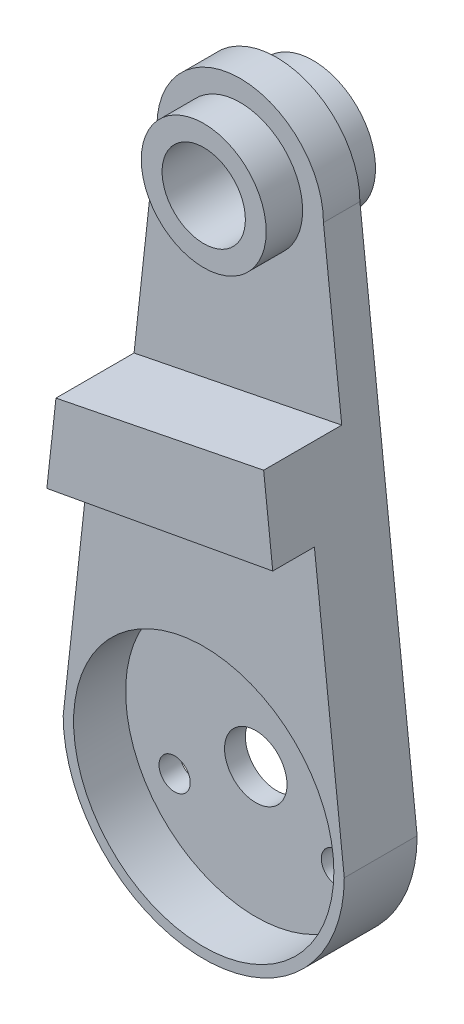
ISO-10303-21;
HEADER;
FILE_DESCRIPTION(('STEP AP214'),'2;1');
FILE_NAME('part.step','',(''),(''),'','','');
FILE_SCHEMA(('AUTOMOTIVE_DESIGN { 1 0 10303 214 1 1 1 1 }'));
ENDSEC;
DATA;
#1=APPLICATION_CONTEXT('core data for automotive mechanical design processes');
#2=APPLICATION_PROTOCOL_DEFINITION('international standard','automotive_design',2000,#1);
#3=PRODUCT_CONTEXT('',#1,'mechanical');
#4=PRODUCT('Part','Part','',(#3));
#5=PRODUCT_RELATED_PRODUCT_CATEGORY('part','',(#4));
#6=PRODUCT_DEFINITION_FORMATION('','',#4);
#7=PRODUCT_DEFINITION_CONTEXT('part definition',#1,'design');
#8=PRODUCT_DEFINITION('design','',#6,#7);
#9=PRODUCT_DEFINITION_SHAPE('','',#8);
#10=(LENGTH_UNIT() NAMED_UNIT(*) SI_UNIT(.MILLI.,.METRE.));
#11=(NAMED_UNIT(*) PLANE_ANGLE_UNIT() SI_UNIT($,.RADIAN.));
#12=(NAMED_UNIT(*) SI_UNIT($,.STERADIAN.) SOLID_ANGLE_UNIT());
#13=UNCERTAINTY_MEASURE_WITH_UNIT(LENGTH_MEASURE(1.E-05),#10,'distance_accuracy_value','');
#14=(GEOMETRIC_REPRESENTATION_CONTEXT(3) GLOBAL_UNCERTAINTY_ASSIGNED_CONTEXT((#13)) GLOBAL_UNIT_ASSIGNED_CONTEXT((#10,
#11,#12)) REPRESENTATION_CONTEXT('',''));
#15=CARTESIAN_POINT('',(0.,0.,0.));
#16=DIRECTION('',(0.,0.,1.));
#17=DIRECTION('',(1.,0.,0.));
#18=AXIS2_PLACEMENT_3D('',#15,#16,#17);
#19=CARTESIAN_POINT('',(0.,0.,0.));
#20=DIRECTION('',(0.,0.,-1.));
#21=DIRECTION('',(-1.,0.,0.));
#22=AXIS2_PLACEMENT_3D('',#19,#20,#21);
#23=PLANE('',#22);
#24=CARTESIAN_POINT('',(0.,0.,0.));
#25=DIRECTION('',(0.,0.,1.));
#26=DIRECTION('',(-1.,0.,0.));
#27=AXIS2_PLACEMENT_3D('',#24,#25,#26);
#28=CIRCLE('',#27,8.);
#29=CARTESIAN_POINT('',(8.,0.,0.));
#30=VERTEX_POINT('',#29);
#31=CARTESIAN_POINT('',(-8.,0.,0.));
#32=VERTEX_POINT('',#31);
#33=EDGE_CURVE('E84',#30,#32,#28,.T.);
#34=ORIENTED_EDGE('',*,*,#33,.F.);
#35=DIRECTION('',(-0.109340479152897,0.994004355935433,0.));
#36=VECTOR('',#35,1.);
#37=CARTESIAN_POINT('',(8.,0.,0.));
#38=LINE('',#37,#36);
#39=CARTESIAN_POINT('',(13.5,-50.,0.));
#40=VERTEX_POINT('',#39);
#41=EDGE_CURVE('E95',#40,#30,#38,.T.);
#42=ORIENTED_EDGE('',*,*,#41,.F.);
#43=CARTESIAN_POINT('',(0.,-50.,0.));
#44=DIRECTION('',(0.,0.,1.));
#45=DIRECTION('',(1.,0.,0.));
#46=AXIS2_PLACEMENT_3D('',#43,#44,#45);
#47=CIRCLE('',#46,13.5);
#48=CARTESIAN_POINT('',(-13.5,-50.,0.));
#49=VERTEX_POINT('',#48);
#50=EDGE_CURVE('E101',#49,#40,#47,.T.);
#51=ORIENTED_EDGE('',*,*,#50,.F.);
#52=DIRECTION('',(-0.109340479152897,-0.994004355935433,0.));
#53=VECTOR('',#52,1.);
#54=CARTESIAN_POINT('',(-8.,0.,0.));
#55=LINE('',#54,#53);
#56=EDGE_CURVE('E105',#32,#49,#55,.T.);
#57=ORIENTED_EDGE('',*,*,#56,.F.);
#58=EDGE_LOOP('',(#34,#42,#51,#57));
#59=FACE_BOUND('',#58,.T.);
#60=CARTESIAN_POINT('',(0.,-50.,0.));
#61=DIRECTION('',(0.,0.,1.));
#62=DIRECTION('',(1.,0.,0.));
#63=AXIS2_PLACEMENT_3D('',#60,#61,#62);
#64=CIRCLE('',#63,3.);
#65=CARTESIAN_POINT('',(3.00000000000001,-50.,0.));
#66=VERTEX_POINT('',#65);
#67=EDGE_CURVE('E106',#66,#66,#64,.T.);
#68=ORIENTED_EDGE('',*,*,#67,.T.);
#69=EDGE_LOOP('',(#68));
#70=FACE_BOUND('',#69,.T.);
#71=CARTESIAN_POINT('',(7.79422863405994,-54.5,0.));
#72=DIRECTION('',(0.,0.,1.));
#73=DIRECTION('',(1.,0.,0.));
#74=AXIS2_PLACEMENT_3D('',#71,#72,#73);
#75=CIRCLE('',#74,1.5);
#76=CARTESIAN_POINT('',(9.29422863405994,-54.5,0.));
#77=VERTEX_POINT('',#76);
#78=EDGE_CURVE('E182',#77,#77,#75,.T.);
#79=ORIENTED_EDGE('',*,*,#78,.T.);
#80=EDGE_LOOP('',(#79));
#81=FACE_BOUND('',#80,.T.);
#82=CARTESIAN_POINT('',(-7.79422863405992,-54.5,0.));
#83=DIRECTION('',(0.,0.,1.));
#84=DIRECTION('',(1.,0.,0.));
#85=AXIS2_PLACEMENT_3D('',#82,#83,#84);
#86=CIRCLE('',#85,1.5);
#87=CARTESIAN_POINT('',(-6.29422863405992,-54.5,0.));
#88=VERTEX_POINT('',#87);
#89=EDGE_CURVE('E185',#88,#88,#86,.T.);
#90=ORIENTED_EDGE('',*,*,#89,.T.);
#91=EDGE_LOOP('',(#90));
#92=FACE_BOUND('',#91,.T.);
#93=CARTESIAN_POINT('',(0.,-41.,0.));
#94=DIRECTION('',(0.,0.,1.));
#95=DIRECTION('',(1.,0.,0.));
#96=AXIS2_PLACEMENT_3D('',#93,#94,#95);
#97=CIRCLE('',#96,1.5);
#98=CARTESIAN_POINT('',(1.5,-41.,0.));
#99=VERTEX_POINT('',#98);
#100=EDGE_CURVE('E110',#99,#99,#97,.T.);
#101=ORIENTED_EDGE('',*,*,#100,.T.);
#102=EDGE_LOOP('',(#101));
#103=FACE_BOUND('',#102,.T.);
#104=CARTESIAN_POINT('',(0.,0.,0.));
#105=DIRECTION('',(0.,0.,-1.));
#106=DIRECTION('',(-1.,0.,0.));
#107=AXIS2_PLACEMENT_3D('',#104,#105,#106);
#108=CIRCLE('',#107,6.);
#109=CARTESIAN_POINT('',(-6.,0.,0.));
#110=VERTEX_POINT('',#109);
#111=EDGE_CURVE('E213',#110,#110,#108,.T.);
#112=ORIENTED_EDGE('',*,*,#111,.F.);
#113=EDGE_LOOP('',(#112));
#114=FACE_BOUND('',#113,.T.);
#115=ADVANCED_FACE('F39',(#59,#70,#81,#92,#103,#114),#23,.T.);
#116=CARTESIAN_POINT('',(0.,0.,7.));
#117=DIRECTION('',(0.,0.,-1.));
#118=DIRECTION('',(-1.,0.,0.));
#119=AXIS2_PLACEMENT_3D('',#116,#117,#118);
#120=PLANE('',#119);
#121=CARTESIAN_POINT('',(0.,-50.,7.));
#122=DIRECTION('',(0.,0.,1.));
#123=DIRECTION('',(1.,0.,0.));
#124=AXIS2_PLACEMENT_3D('',#121,#122,#123);
#125=CIRCLE('',#124,12.5);
#126=CARTESIAN_POINT('',(12.5,-50.,7.));
#127=VERTEX_POINT('',#126);
#128=EDGE_CURVE('E169',#127,#127,#125,.T.);
#129=ORIENTED_EDGE('',*,*,#128,.F.);
#130=EDGE_LOOP('',(#129));
#131=FACE_BOUND('',#130,.T.);
#132=DIRECTION('',(0.983623545407189,0.180235182249724,0.));
#133=VECTOR('',#132,1.);
#134=CARTESIAN_POINT('',(-11.0681286247522,-27.8920784068378,7.));
#135=LINE('',#134,#133);
#136=CARTESIAN_POINT('',(-11.0681286247522,-27.8920784068378,7.));
#137=VERTEX_POINT('',#136);
#138=CARTESIAN_POINT('',(10.6307667081406,-23.9160609830961,7.));
#139=VERTEX_POINT('',#138);
#140=EDGE_CURVE('E54',#137,#139,#135,.T.);
#141=ORIENTED_EDGE('',*,*,#140,.F.);
#142=DIRECTION('',(-0.109340479152897,-0.994004355935433,0.));
#143=VECTOR('',#142,1.);
#144=CARTESIAN_POINT('',(-8.,0.,7.));
#145=LINE('',#144,#143);
#146=CARTESIAN_POINT('',(-13.5,-50.,7.));
#147=VERTEX_POINT('',#146);
#148=EDGE_CURVE('E100',#137,#147,#145,.T.);
#149=ORIENTED_EDGE('',*,*,#148,.T.);
#150=CARTESIAN_POINT('',(0.,-50.,7.));
#151=DIRECTION('',(0.,0.,1.));
#152=DIRECTION('',(1.,0.,0.));
#153=AXIS2_PLACEMENT_3D('',#150,#151,#152);
#154=CIRCLE('',#153,13.5);
#155=CARTESIAN_POINT('',(13.5,-50.,7.));
#156=VERTEX_POINT('',#155);
#157=EDGE_CURVE('E60',#147,#156,#154,.T.);
#158=ORIENTED_EDGE('',*,*,#157,.T.);
#159=DIRECTION('',(-0.109340479152897,0.994004355935433,0.));
#160=VECTOR('',#159,1.);
#161=CARTESIAN_POINT('',(8.,0.,7.));
#162=LINE('',#161,#160);
#163=EDGE_CURVE('E91',#156,#139,#162,.T.);
#164=ORIENTED_EDGE('',*,*,#163,.T.);
#165=EDGE_LOOP('',(#141,#149,#158,#164));
#166=FACE_BOUND('',#165,.T.);
#167=ADVANCED_FACE('F191',(#131,#166),#120,.F.);
#168=CARTESIAN_POINT('',(0.,-50.,0.));
#169=DIRECTION('',(0.,0.,1.));
#170=DIRECTION('',(1.,0.,0.));
#171=AXIS2_PLACEMENT_3D('',#168,#169,#170);
#172=CYLINDRICAL_SURFACE('',#171,3.);
#173=ORIENTED_EDGE('',*,*,#67,.F.);
#174=EDGE_LOOP('',(#173));
#175=FACE_BOUND('',#174,.T.);
#176=CARTESIAN_POINT('',(0.,-50.,2.));
#177=DIRECTION('',(0.,0.,1.));
#178=DIRECTION('',(1.,0.,0.));
#179=AXIS2_PLACEMENT_3D('',#176,#177,#178);
#180=CIRCLE('',#179,3.);
#181=CARTESIAN_POINT('',(3.00000000000001,-50.,2.));
#182=VERTEX_POINT('',#181);
#183=EDGE_CURVE('E179',#182,#182,#180,.F.);
#184=ORIENTED_EDGE('',*,*,#183,.F.);
#185=EDGE_LOOP('',(#184));
#186=FACE_BOUND('',#185,.T.);
#187=ADVANCED_FACE('F243',(#175,#186),#172,.F.);
#188=CARTESIAN_POINT('',(7.79422863405994,-54.5,0.));
#189=DIRECTION('',(0.,0.,1.));
#190=DIRECTION('',(1.,0.,0.));
#191=AXIS2_PLACEMENT_3D('',#188,#189,#190);
#192=CYLINDRICAL_SURFACE('',#191,1.5);
#193=ORIENTED_EDGE('',*,*,#78,.F.);
#194=EDGE_LOOP('',(#193));
#195=FACE_BOUND('',#194,.T.);
#196=CARTESIAN_POINT('',(7.79422863405994,-54.5,2.));
#197=DIRECTION('',(0.,0.,1.));
#198=DIRECTION('',(1.,0.,0.));
#199=AXIS2_PLACEMENT_3D('',#196,#197,#198);
#200=CIRCLE('',#199,1.5);
#201=CARTESIAN_POINT('',(9.29422863405994,-54.5,2.));
#202=VERTEX_POINT('',#201);
#203=EDGE_CURVE('E176',#202,#202,#200,.F.);
#204=ORIENTED_EDGE('',*,*,#203,.F.);
#205=EDGE_LOOP('',(#204));
#206=FACE_BOUND('',#205,.T.);
#207=ADVANCED_FACE('F279',(#195,#206),#192,.F.);
#208=CARTESIAN_POINT('',(-7.79422863405992,-54.5,0.));
#209=DIRECTION('',(0.,0.,1.));
#210=DIRECTION('',(1.,0.,0.));
#211=AXIS2_PLACEMENT_3D('',#208,#209,#210);
#212=CYLINDRICAL_SURFACE('',#211,1.5);
#213=ORIENTED_EDGE('',*,*,#89,.F.);
#214=EDGE_LOOP('',(#213));
#215=FACE_BOUND('',#214,.T.);
#216=CARTESIAN_POINT('',(-7.79422863405992,-54.5,2.));
#217=DIRECTION('',(0.,0.,1.));
#218=DIRECTION('',(1.,0.,0.));
#219=AXIS2_PLACEMENT_3D('',#216,#217,#218);
#220=CIRCLE('',#219,1.5);
#221=CARTESIAN_POINT('',(-6.29422863405992,-54.5,2.));
#222=VERTEX_POINT('',#221);
#223=EDGE_CURVE('E124',#222,#222,#220,.F.);
#224=ORIENTED_EDGE('',*,*,#223,.F.);
#225=EDGE_LOOP('',(#224));
#226=FACE_BOUND('',#225,.T.);
#227=ADVANCED_FACE('F273',(#215,#226),#212,.F.);
#228=CARTESIAN_POINT('',(0.,-41.,0.));
#229=DIRECTION('',(0.,0.,1.));
#230=DIRECTION('',(1.,0.,0.));
#231=AXIS2_PLACEMENT_3D('',#228,#229,#230);
#232=CYLINDRICAL_SURFACE('',#231,1.5);
#233=ORIENTED_EDGE('',*,*,#100,.F.);
#234=EDGE_LOOP('',(#233));
#235=FACE_BOUND('',#234,.T.);
#236=CARTESIAN_POINT('',(0.,-41.,2.));
#237=DIRECTION('',(0.,0.,1.));
#238=DIRECTION('',(1.,0.,0.));
#239=AXIS2_PLACEMENT_3D('',#236,#237,#238);
#240=CIRCLE('',#239,1.5);
#241=CARTESIAN_POINT('',(1.5,-41.,2.));
#242=VERTEX_POINT('',#241);
#243=EDGE_CURVE('E122',#242,#242,#240,.F.);
#244=ORIENTED_EDGE('',*,*,#243,.F.);
#245=EDGE_LOOP('',(#244));
#246=FACE_BOUND('',#245,.T.);
#247=ADVANCED_FACE('F260',(#235,#246),#232,.F.);
#248=CARTESIAN_POINT('',(0.,0.,7.));
#249=DIRECTION('',(0.,0.,-1.));
#250=DIRECTION('',(-1.,0.,0.));
#251=AXIS2_PLACEMENT_3D('',#248,#249,#250);
#252=CYLINDRICAL_SURFACE('',#251,8.);
#253=DIRECTION('',(0.,0.,-1.));
#254=VECTOR('',#253,1.);
#255=CARTESIAN_POINT('',(-8.,0.,7.));
#256=LINE('',#255,#254);
#257=CARTESIAN_POINT('',(-8.,0.,3.5));
#258=VERTEX_POINT('',#257);
#259=EDGE_CURVE('E120',#258,#32,#256,.T.);
#260=ORIENTED_EDGE('',*,*,#259,.F.);
#261=CARTESIAN_POINT('',(0.,0.,3.5));
#262=DIRECTION('',(0.,0.,-1.));
#263=DIRECTION('',(-1.,0.,0.));
#264=AXIS2_PLACEMENT_3D('',#261,#262,#263);
#265=CIRCLE('',#264,8.);
#266=CARTESIAN_POINT('',(8.,0.,3.5));
#267=VERTEX_POINT('',#266);
#268=EDGE_CURVE('E87',#258,#267,#265,.T.);
#269=ORIENTED_EDGE('',*,*,#268,.T.);
#270=DIRECTION('',(0.,0.,-1.));
#271=VECTOR('',#270,1.);
#272=CARTESIAN_POINT('',(8.,0.,7.));
#273=LINE('',#272,#271);
#274=EDGE_CURVE('E80',#267,#30,#273,.T.);
#275=ORIENTED_EDGE('',*,*,#274,.T.);
#276=ORIENTED_EDGE('',*,*,#33,.T.);
#277=EDGE_LOOP('',(#260,#269,#275,#276));
#278=FACE_BOUND('',#277,.T.);
#279=ADVANCED_FACE('F41',(#278),#252,.T.);
#280=CARTESIAN_POINT('',(-8.,0.,7.));
#281=DIRECTION('',(0.994004355935433,-0.109340479152897,0.));
#282=DIRECTION('',(0.109340479152897,0.994004355935433,0.));
#283=AXIS2_PLACEMENT_3D('',#280,#281,#282);
#284=PLANE('',#283);
#285=ORIENTED_EDGE('',*,*,#148,.F.);
#286=DIRECTION('',(0.,0.,-1.));
#287=VECTOR('',#286,1.);
#288=CARTESIAN_POINT('',(-11.0681286247522,-27.8920784068378,11.));
#289=LINE('',#288,#287);
#290=CARTESIAN_POINT('',(-11.0681286247522,-27.8920784068378,11.));
#291=VERTEX_POINT('',#290);
#292=EDGE_CURVE('E154',#291,#137,#289,.T.);
#293=ORIENTED_EDGE('',*,*,#292,.F.);
#294=DIRECTION('',(-0.109340479152897,-0.994004355935433,0.));
#295=VECTOR('',#294,1.);
#296=CARTESIAN_POINT('',(-10.193404791529,-19.9400435593543,11.));
#297=LINE('',#296,#295);
#298=CARTESIAN_POINT('',(-10.193404791529,-19.9400435593543,11.));
#299=VERTEX_POINT('',#298);
#300=EDGE_CURVE('E201',#299,#291,#297,.T.);
#301=ORIENTED_EDGE('',*,*,#300,.F.);
#302=DIRECTION('',(0.,0.,1.));
#303=VECTOR('',#302,1.);
#304=CARTESIAN_POINT('',(-10.193404791529,-19.9400435593543,3.5));
#305=LINE('',#304,#303);
#306=CARTESIAN_POINT('',(-10.193404791529,-19.9400435593543,3.5));
#307=VERTEX_POINT('',#306);
#308=EDGE_CURVE('E148',#307,#299,#305,.T.);
#309=ORIENTED_EDGE('',*,*,#308,.F.);
#310=DIRECTION('',(0.109340479152897,0.994004355935433,0.));
#311=VECTOR('',#310,1.);
#312=CARTESIAN_POINT('',(-8.,0.,3.5));
#313=LINE('',#312,#311);
#314=EDGE_CURVE('E153',#307,#258,#313,.T.);
#315=ORIENTED_EDGE('',*,*,#314,.T.);
#316=ORIENTED_EDGE('',*,*,#259,.T.);
#317=ORIENTED_EDGE('',*,*,#56,.T.);
#318=DIRECTION('',(0.,0.,-1.));
#319=VECTOR('',#318,1.);
#320=CARTESIAN_POINT('',(-13.5,-50.,7.));
#321=LINE('',#320,#319);
#322=EDGE_CURVE('E117',#147,#49,#321,.T.);
#323=ORIENTED_EDGE('',*,*,#322,.F.);
#324=EDGE_LOOP('',(#285,#293,#301,#309,#315,#316,#317,#323));
#325=FACE_BOUND('',#324,.T.);
#326=ADVANCED_FACE('F253',(#325),#284,.F.);
#327=CARTESIAN_POINT('',(0.,-50.,7.));
#328=DIRECTION('',(0.,0.,-1.));
#329=DIRECTION('',(-1.,0.,0.));
#330=AXIS2_PLACEMENT_3D('',#327,#328,#329);
#331=CYLINDRICAL_SURFACE('',#330,13.5);
#332=ORIENTED_EDGE('',*,*,#50,.T.);
#333=DIRECTION('',(0.,0.,-1.));
#334=VECTOR('',#333,1.);
#335=CARTESIAN_POINT('',(13.5,-50.,7.));
#336=LINE('',#335,#334);
#337=EDGE_CURVE('E90',#156,#40,#336,.T.);
#338=ORIENTED_EDGE('',*,*,#337,.F.);
#339=ORIENTED_EDGE('',*,*,#157,.F.);
#340=ORIENTED_EDGE('',*,*,#322,.T.);
#341=EDGE_LOOP('',(#332,#338,#339,#340));
#342=FACE_BOUND('',#341,.T.);
#343=ADVANCED_FACE('F251',(#342),#331,.T.);
#344=CARTESIAN_POINT('',(8.,0.,7.));
#345=DIRECTION('',(-0.994004355935433,-0.109340479152897,0.));
#346=DIRECTION('',(0.109340479152897,-0.994004355935433,0.));
#347=AXIS2_PLACEMENT_3D('',#344,#345,#346);
#348=PLANE('',#347);
#349=DIRECTION('',(0.109340479152897,-0.994004355935433,0.));
#350=VECTOR('',#349,1.);
#351=CARTESIAN_POINT('',(8.,0.,3.5));
#352=LINE('',#351,#350);
#353=CARTESIAN_POINT('',(9.75604287491738,-15.9640261356126,3.5));
#354=VERTEX_POINT('',#353);
#355=EDGE_CURVE('E47',#267,#354,#352,.T.);
#356=ORIENTED_EDGE('',*,*,#355,.T.);
#357=DIRECTION('',(0.,0.,1.));
#358=VECTOR('',#357,1.);
#359=CARTESIAN_POINT('',(9.75604287491738,-15.9640261356126,3.5));
#360=LINE('',#359,#358);
#361=CARTESIAN_POINT('',(9.75604287491738,-15.9640261356126,11.));
#362=VERTEX_POINT('',#361);
#363=EDGE_CURVE('E132',#354,#362,#360,.T.);
#364=ORIENTED_EDGE('',*,*,#363,.T.);
#365=DIRECTION('',(-0.109340479152898,0.994004355935433,0.));
#366=VECTOR('',#365,1.);
#367=CARTESIAN_POINT('',(9.75604287491738,-15.9640261356126,11.));
#368=LINE('',#367,#366);
#369=CARTESIAN_POINT('',(10.6307667081406,-23.9160609830961,11.));
#370=VERTEX_POINT('',#369);
#371=EDGE_CURVE('E204',#370,#362,#368,.T.);
#372=ORIENTED_EDGE('',*,*,#371,.F.);
#373=DIRECTION('',(0.,0.,-1.));
#374=VECTOR('',#373,1.);
#375=CARTESIAN_POINT('',(10.6307667081406,-23.9160609830961,11.));
#376=LINE('',#375,#374);
#377=EDGE_CURVE('E158',#370,#139,#376,.T.);
#378=ORIENTED_EDGE('',*,*,#377,.T.);
#379=ORIENTED_EDGE('',*,*,#163,.F.);
#380=ORIENTED_EDGE('',*,*,#337,.T.);
#381=ORIENTED_EDGE('',*,*,#41,.T.);
#382=ORIENTED_EDGE('',*,*,#274,.F.);
#383=EDGE_LOOP('',(#356,#364,#372,#378,#379,#380,#381,#382));
#384=FACE_BOUND('',#383,.T.);
#385=ADVANCED_FACE('F96',(#384),#348,.F.);
#386=CARTESIAN_POINT('',(0.,-50.,2.));
#387=DIRECTION('',(0.,0.,1.));
#388=DIRECTION('',(1.,0.,0.));
#389=AXIS2_PLACEMENT_3D('',#386,#387,#388);
#390=PLANE('',#389);
#391=CARTESIAN_POINT('',(0.,-50.,2.));
#392=DIRECTION('',(0.,0.,1.));
#393=DIRECTION('',(1.,0.,0.));
#394=AXIS2_PLACEMENT_3D('',#391,#392,#393);
#395=CIRCLE('',#394,12.5);
#396=CARTESIAN_POINT('',(12.5,-50.,2.));
#397=VERTEX_POINT('',#396);
#398=EDGE_CURVE('E125',#397,#397,#395,.T.);
#399=ORIENTED_EDGE('',*,*,#398,.T.);
#400=EDGE_LOOP('',(#399));
#401=FACE_BOUND('',#400,.T.);
#402=ORIENTED_EDGE('',*,*,#243,.T.);
#403=EDGE_LOOP('',(#402));
#404=FACE_BOUND('',#403,.T.);
#405=ORIENTED_EDGE('',*,*,#223,.T.);
#406=EDGE_LOOP('',(#405));
#407=FACE_BOUND('',#406,.T.);
#408=ORIENTED_EDGE('',*,*,#203,.T.);
#409=EDGE_LOOP('',(#408));
#410=FACE_BOUND('',#409,.T.);
#411=ORIENTED_EDGE('',*,*,#183,.T.);
#412=EDGE_LOOP('',(#411));
#413=FACE_BOUND('',#412,.T.);
#414=ADVANCED_FACE('F250',(#401,#404,#407,#410,#413),#390,.T.);
#415=CARTESIAN_POINT('',(0.,-50.,2.));
#416=DIRECTION('',(0.,0.,1.));
#417=DIRECTION('',(1.,0.,0.));
#418=AXIS2_PLACEMENT_3D('',#415,#416,#417);
#419=CYLINDRICAL_SURFACE('',#418,12.5);
#420=ORIENTED_EDGE('',*,*,#398,.F.);
#421=EDGE_LOOP('',(#420));
#422=FACE_BOUND('',#421,.T.);
#423=ORIENTED_EDGE('',*,*,#128,.T.);
#424=EDGE_LOOP('',(#423));
#425=FACE_BOUND('',#424,.T.);
#426=ADVANCED_FACE('F285',(#422,#425),#419,.F.);
#427=CARTESIAN_POINT('',(13.5,-10.,3.5));
#428=DIRECTION('',(0.,0.,-1.));
#429=DIRECTION('',(-1.,0.,0.));
#430=AXIS2_PLACEMENT_3D('',#427,#428,#429);
#431=PLANE('',#430);
#432=CARTESIAN_POINT('',(0.,0.,3.5));
#433=DIRECTION('',(0.,0.,-1.));
#434=DIRECTION('',(-1.,0.,0.));
#435=AXIS2_PLACEMENT_3D('',#432,#433,#434);
#436=CIRCLE('',#435,6.);
#437=CARTESIAN_POINT('',(-6.,0.,3.5));
#438=VERTEX_POINT('',#437);
#439=EDGE_CURVE('E11',#438,#438,#436,.F.);
#440=ORIENTED_EDGE('',*,*,#439,.F.);
#441=EDGE_LOOP('',(#440));
#442=FACE_BOUND('',#441,.T.);
#443=ORIENTED_EDGE('',*,*,#314,.F.);
#444=DIRECTION('',(0.98071160080318,0.195460369512761,0.));
#445=VECTOR('',#444,1.);
#446=CARTESIAN_POINT('',(-10.193404791529,-19.9400435593543,3.5));
#447=LINE('',#446,#445);
#448=EDGE_CURVE('E143',#307,#354,#447,.T.);
#449=ORIENTED_EDGE('',*,*,#448,.T.);
#450=ORIENTED_EDGE('',*,*,#355,.F.);
#451=ORIENTED_EDGE('',*,*,#268,.F.);
#452=EDGE_LOOP('',(#443,#449,#450,#451));
#453=FACE_BOUND('',#452,.T.);
#454=ADVANCED_FACE('F151',(#442,#453),#431,.F.);
#455=CARTESIAN_POINT('',(0.,0.,7.));
#456=DIRECTION('',(0.,0.,-1.));
#457=DIRECTION('',(-1.,0.,0.));
#458=AXIS2_PLACEMENT_3D('',#455,#456,#457);
#459=CYLINDRICAL_SURFACE('',#458,6.);
#460=CARTESIAN_POINT('',(0.,0.,7.));
#461=DIRECTION('',(0.,0.,1.));
#462=DIRECTION('',(1.,0.,0.));
#463=AXIS2_PLACEMENT_3D('',#460,#461,#462);
#464=CIRCLE('',#463,6.);
#465=CARTESIAN_POINT('',(6.,0.,7.));
#466=VERTEX_POINT('',#465);
#467=EDGE_CURVE('E164',#466,#466,#464,.T.);
#468=ORIENTED_EDGE('',*,*,#467,.F.);
#469=EDGE_LOOP('',(#468));
#470=FACE_BOUND('',#469,.T.);
#471=ORIENTED_EDGE('',*,*,#439,.T.);
#472=EDGE_LOOP('',(#471));
#473=FACE_BOUND('',#472,.T.);
#474=ADVANCED_FACE('F308',(#470,#473),#459,.T.);
#475=CARTESIAN_POINT('',(0.,0.,7.));
#476=DIRECTION('',(0.,0.,1.));
#477=DIRECTION('',(1.,0.,0.));
#478=AXIS2_PLACEMENT_3D('',#475,#476,#477);
#479=PLANE('',#478);
#480=CARTESIAN_POINT('',(0.,0.,7.));
#481=DIRECTION('',(0.,0.,1.));
#482=DIRECTION('',(1.,0.,0.));
#483=AXIS2_PLACEMENT_3D('',#480,#481,#482);
#484=CIRCLE('',#483,4.);
#485=CARTESIAN_POINT('',(4.,0.,7.));
#486=VERTEX_POINT('',#485);
#487=EDGE_CURVE('E147',#486,#486,#484,.T.);
#488=ORIENTED_EDGE('',*,*,#487,.F.);
#489=EDGE_LOOP('',(#488));
#490=FACE_BOUND('',#489,.T.);
#491=ORIENTED_EDGE('',*,*,#467,.T.);
#492=EDGE_LOOP('',(#491));
#493=FACE_BOUND('',#492,.T.);
#494=ADVANCED_FACE('F312',(#490,#493),#479,.T.);
#495=CARTESIAN_POINT('',(0.,0.,0.));
#496=DIRECTION('',(0.,0.,1.));
#497=DIRECTION('',(1.,0.,0.));
#498=AXIS2_PLACEMENT_3D('',#495,#496,#497);
#499=CYLINDRICAL_SURFACE('',#498,4.);
#500=ORIENTED_EDGE('',*,*,#487,.T.);
#501=EDGE_LOOP('',(#500));
#502=FACE_BOUND('',#501,.T.);
#503=CARTESIAN_POINT('',(0.,0.,-3.5));
#504=DIRECTION('',(0.,0.,-1.));
#505=DIRECTION('',(-1.,0.,0.));
#506=AXIS2_PLACEMENT_3D('',#503,#504,#505);
#507=CIRCLE('',#506,4.);
#508=CARTESIAN_POINT('',(-4.,0.,-3.5));
#509=VERTEX_POINT('',#508);
#510=EDGE_CURVE('E216',#509,#509,#507,.T.);
#511=ORIENTED_EDGE('',*,*,#510,.T.);
#512=EDGE_LOOP('',(#511));
#513=FACE_BOUND('',#512,.T.);
#514=ADVANCED_FACE('F222',(#502,#513),#499,.F.);
#515=CARTESIAN_POINT('',(-10.193404791529,-19.9400435593543,3.5));
#516=DIRECTION('',(0.195460369512761,-0.98071160080318,0.));
#517=DIRECTION('',(0.98071160080318,0.195460369512761,0.));
#518=AXIS2_PLACEMENT_3D('',#515,#516,#517);
#519=PLANE('',#518);
#520=ORIENTED_EDGE('',*,*,#308,.T.);
#521=DIRECTION('',(-0.98071160080318,-0.195460369512761,0.));
#522=VECTOR('',#521,1.);
#523=CARTESIAN_POINT('',(-10.193404791529,-19.9400435593543,11.));
#524=LINE('',#523,#522);
#525=EDGE_CURVE('E146',#362,#299,#524,.T.);
#526=ORIENTED_EDGE('',*,*,#525,.F.);
#527=ORIENTED_EDGE('',*,*,#363,.F.);
#528=ORIENTED_EDGE('',*,*,#448,.F.);
#529=EDGE_LOOP('',(#520,#526,#527,#528));
#530=FACE_BOUND('',#529,.T.);
#531=ADVANCED_FACE('F142',(#530),#519,.F.);
#532=CARTESIAN_POINT('',(-11.0681286247522,-27.8920784068378,11.));
#533=DIRECTION('',(-0.180235182249724,0.983623545407189,0.));
#534=DIRECTION('',(-0.983623545407189,-0.180235182249724,0.));
#535=AXIS2_PLACEMENT_3D('',#532,#533,#534);
#536=PLANE('',#535);
#537=ORIENTED_EDGE('',*,*,#140,.T.);
#538=ORIENTED_EDGE('',*,*,#377,.F.);
#539=DIRECTION('',(0.983623545407189,0.180235182249724,0.));
#540=VECTOR('',#539,1.);
#541=CARTESIAN_POINT('',(-11.0681286247522,-27.8920784068378,11.));
#542=LINE('',#541,#540);
#543=EDGE_CURVE('E208',#291,#370,#542,.T.);
#544=ORIENTED_EDGE('',*,*,#543,.F.);
#545=ORIENTED_EDGE('',*,*,#292,.T.);
#546=EDGE_LOOP('',(#537,#538,#544,#545));
#547=FACE_BOUND('',#546,.T.);
#548=ADVANCED_FACE('F197',(#547),#536,.F.);
#549=CARTESIAN_POINT('',(0.,0.,11.));
#550=DIRECTION('',(0.,0.,1.));
#551=DIRECTION('',(1.,0.,0.));
#552=AXIS2_PLACEMENT_3D('',#549,#550,#551);
#553=PLANE('',#552);
#554=ORIENTED_EDGE('',*,*,#300,.T.);
#555=ORIENTED_EDGE('',*,*,#543,.T.);
#556=ORIENTED_EDGE('',*,*,#371,.T.);
#557=ORIENTED_EDGE('',*,*,#525,.T.);
#558=EDGE_LOOP('',(#554,#555,#556,#557));
#559=FACE_BOUND('',#558,.T.);
#560=ADVANCED_FACE('F227',(#559),#553,.T.);
#561=CARTESIAN_POINT('',(0.,0.,-3.5));
#562=DIRECTION('',(0.,0.,-1.));
#563=DIRECTION('',(-1.,0.,0.));
#564=AXIS2_PLACEMENT_3D('',#561,#562,#563);
#565=PLANE('',#564);
#566=CARTESIAN_POINT('',(0.,0.,-3.5));
#567=DIRECTION('',(0.,0.,-1.));
#568=DIRECTION('',(-1.,0.,0.));
#569=AXIS2_PLACEMENT_3D('',#566,#567,#568);
#570=CIRCLE('',#569,6.);
#571=CARTESIAN_POINT('',(-6.,0.,-3.5));
#572=VERTEX_POINT('',#571);
#573=EDGE_CURVE('E202',#572,#572,#570,.T.);
#574=ORIENTED_EDGE('',*,*,#573,.T.);
#575=EDGE_LOOP('',(#574));
#576=FACE_BOUND('',#575,.T.);
#577=ORIENTED_EDGE('',*,*,#510,.F.);
#578=EDGE_LOOP('',(#577));
#579=FACE_BOUND('',#578,.T.);
#580=ADVANCED_FACE('F224',(#576,#579),#565,.T.);
#581=CARTESIAN_POINT('',(0.,0.,-3.5));
#582=DIRECTION('',(0.,0.,1.));
#583=DIRECTION('',(1.,0.,0.));
#584=AXIS2_PLACEMENT_3D('',#581,#582,#583);
#585=CYLINDRICAL_SURFACE('',#584,6.);
#586=ORIENTED_EDGE('',*,*,#573,.F.);
#587=EDGE_LOOP('',(#586));
#588=FACE_BOUND('',#587,.T.);
#589=ORIENTED_EDGE('',*,*,#111,.T.);
#590=EDGE_LOOP('',(#589));
#591=FACE_BOUND('',#590,.T.);
#592=ADVANCED_FACE('F226',(#588,#591),#585,.T.);
#593=CLOSED_SHELL('',(#115,#167,#187,#207,#227,#247,#279,#326,#343,#385,#414,#426,#454,#474,
#494,#514,#531,#548,#560,#580,#592));
#594=MANIFOLD_SOLID_BREP('B2',#593);
#595=ADVANCED_BREP_SHAPE_REPRESENTATION('',(#18,#594),#14);
#596=SHAPE_DEFINITION_REPRESENTATION(#9,#595);
ENDSEC;
END-ISO-10303-21;
